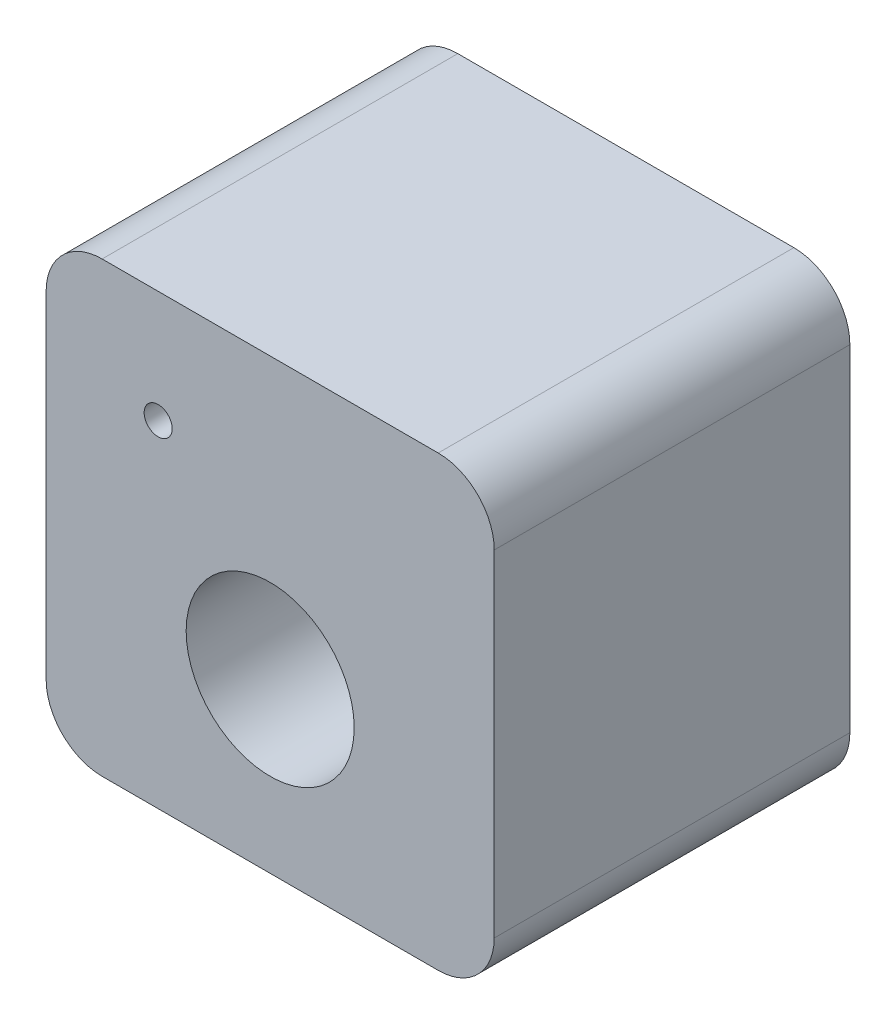
ISO-10303-21;
HEADER;
FILE_DESCRIPTION(('STEP AP214'),'2;1');
FILE_NAME('part.step','',(''),(''),'','','');
FILE_SCHEMA(('AUTOMOTIVE_DESIGN { 1 0 10303 214 1 1 1 1 }'));
ENDSEC;
DATA;
#1=APPLICATION_CONTEXT('core data for automotive mechanical design processes');
#2=APPLICATION_PROTOCOL_DEFINITION('international standard','automotive_design',2000,#1);
#3=PRODUCT_CONTEXT('',#1,'mechanical');
#4=PRODUCT('Part','Part','',(#3));
#5=PRODUCT_RELATED_PRODUCT_CATEGORY('part','',(#4));
#6=PRODUCT_DEFINITION_FORMATION('','',#4);
#7=PRODUCT_DEFINITION_CONTEXT('part definition',#1,'design');
#8=PRODUCT_DEFINITION('design','',#6,#7);
#9=PRODUCT_DEFINITION_SHAPE('','',#8);
#10=(LENGTH_UNIT() NAMED_UNIT(*) SI_UNIT(.MILLI.,.METRE.));
#11=(NAMED_UNIT(*) PLANE_ANGLE_UNIT() SI_UNIT($,.RADIAN.));
#12=(NAMED_UNIT(*) SI_UNIT($,.STERADIAN.) SOLID_ANGLE_UNIT());
#13=UNCERTAINTY_MEASURE_WITH_UNIT(LENGTH_MEASURE(1.E-05),#10,'distance_accuracy_value','');
#14=(GEOMETRIC_REPRESENTATION_CONTEXT(3) GLOBAL_UNCERTAINTY_ASSIGNED_CONTEXT((#13)) GLOBAL_UNIT_ASSIGNED_CONTEXT((#10,
#11,#12)) REPRESENTATION_CONTEXT('',''));
#15=CARTESIAN_POINT('',(0.,0.,0.));
#16=DIRECTION('',(0.,0.,1.));
#17=DIRECTION('',(1.,0.,0.));
#18=AXIS2_PLACEMENT_3D('',#15,#16,#17);
#19=CARTESIAN_POINT('',(0.,0.,6.35));
#20=DIRECTION('',(0.,0.,-1.));
#21=DIRECTION('',(-1.,0.,0.));
#22=AXIS2_PLACEMENT_3D('',#19,#20,#21);
#23=PLANE('',#22);
#24=CARTESIAN_POINT('',(4.,3.,6.35));
#25=DIRECTION('',(0.,0.,1.));
#26=DIRECTION('',(1.,0.,0.));
#27=AXIS2_PLACEMENT_3D('',#24,#25,#26);
#28=CIRCLE('',#27,1.5);
#29=CARTESIAN_POINT('',(5.5,3.,6.35));
#30=VERTEX_POINT('',#29);
#31=EDGE_CURVE('E132',#30,#30,#28,.T.);
#32=ORIENTED_EDGE('',*,*,#31,.F.);
#33=EDGE_LOOP('',(#32));
#34=FACE_BOUND('',#33,.T.);
#35=DIRECTION('',(0.,-1.,0.));
#36=VECTOR('',#35,1.);
#37=CARTESIAN_POINT('',(0.,0.,6.35));
#38=LINE('',#37,#36);
#39=CARTESIAN_POINT('',(0.,7.,6.35));
#40=VERTEX_POINT('',#39);
#41=CARTESIAN_POINT('',(0.,1.,6.35));
#42=VERTEX_POINT('',#41);
#43=EDGE_CURVE('E137',#40,#42,#38,.T.);
#44=ORIENTED_EDGE('',*,*,#43,.T.);
#45=CARTESIAN_POINT('',(1.,1.,6.35));
#46=DIRECTION('',(0.,0.,-1.));
#47=DIRECTION('',(-1.,0.,0.));
#48=AXIS2_PLACEMENT_3D('',#45,#46,#47);
#49=CIRCLE('',#48,1.);
#50=CARTESIAN_POINT('',(1.,0.,6.35));
#51=VERTEX_POINT('',#50);
#52=EDGE_CURVE('E152',#42,#51,#49,.F.);
#53=ORIENTED_EDGE('',*,*,#52,.T.);
#54=DIRECTION('',(1.,0.,0.));
#55=VECTOR('',#54,1.);
#56=CARTESIAN_POINT('',(0.,0.,6.35));
#57=LINE('',#56,#55);
#58=CARTESIAN_POINT('',(7.,0.,6.35));
#59=VERTEX_POINT('',#58);
#60=EDGE_CURVE('E119',#51,#59,#57,.T.);
#61=ORIENTED_EDGE('',*,*,#60,.T.);
#62=CARTESIAN_POINT('',(7.,1.,6.35));
#63=DIRECTION('',(0.,0.,-1.));
#64=DIRECTION('',(-1.,0.,0.));
#65=AXIS2_PLACEMENT_3D('',#62,#63,#64);
#66=CIRCLE('',#65,1.);
#67=CARTESIAN_POINT('',(8.,1.,6.35));
#68=VERTEX_POINT('',#67);
#69=EDGE_CURVE('E150',#59,#68,#66,.F.);
#70=ORIENTED_EDGE('',*,*,#69,.T.);
#71=DIRECTION('',(0.,1.,0.));
#72=VECTOR('',#71,1.);
#73=CARTESIAN_POINT('',(8.,0.,6.35));
#74=LINE('',#73,#72);
#75=CARTESIAN_POINT('',(8.,7.,6.35));
#76=VERTEX_POINT('',#75);
#77=EDGE_CURVE('E163',#68,#76,#74,.T.);
#78=ORIENTED_EDGE('',*,*,#77,.T.);
#79=CARTESIAN_POINT('',(7.,7.,6.35));
#80=DIRECTION('',(0.,0.,-1.));
#81=DIRECTION('',(-1.,0.,0.));
#82=AXIS2_PLACEMENT_3D('',#79,#80,#81);
#83=CIRCLE('',#82,1.);
#84=CARTESIAN_POINT('',(7.,8.,6.35));
#85=VERTEX_POINT('',#84);
#86=EDGE_CURVE('E54',#76,#85,#83,.F.);
#87=ORIENTED_EDGE('',*,*,#86,.T.);
#88=DIRECTION('',(-1.,0.,0.));
#89=VECTOR('',#88,1.);
#90=CARTESIAN_POINT('',(0.,8.,6.35));
#91=LINE('',#90,#89);
#92=CARTESIAN_POINT('',(1.,8.,6.35));
#93=VERTEX_POINT('',#92);
#94=EDGE_CURVE('E138',#85,#93,#91,.T.);
#95=ORIENTED_EDGE('',*,*,#94,.T.);
#96=CARTESIAN_POINT('',(1.,7.,6.35));
#97=DIRECTION('',(0.,0.,-1.));
#98=DIRECTION('',(-1.,0.,0.));
#99=AXIS2_PLACEMENT_3D('',#96,#97,#98);
#100=CIRCLE('',#99,1.);
#101=EDGE_CURVE('E147',#93,#40,#100,.F.);
#102=ORIENTED_EDGE('',*,*,#101,.T.);
#103=EDGE_LOOP('',(#44,#53,#61,#70,#78,#87,#95,#102));
#104=FACE_BOUND('',#103,.T.);
#105=CARTESIAN_POINT('',(2.,6.,6.35));
#106=DIRECTION('',(0.,0.,1.));
#107=DIRECTION('',(1.,0.,0.));
#108=AXIS2_PLACEMENT_3D('',#105,#106,#107);
#109=CIRCLE('',#108,0.25);
#110=CARTESIAN_POINT('',(2.25,6.,6.35));
#111=VERTEX_POINT('',#110);
#112=EDGE_CURVE('E180',#111,#111,#109,.T.);
#113=ORIENTED_EDGE('',*,*,#112,.F.);
#114=EDGE_LOOP('',(#113));
#115=FACE_BOUND('',#114,.T.);
#116=ADVANCED_FACE('F33',(#34,#104,#115),#23,.F.);
#117=CARTESIAN_POINT('',(0.,0.,0.));
#118=DIRECTION('',(0.,0.,-1.));
#119=DIRECTION('',(-1.,0.,0.));
#120=AXIS2_PLACEMENT_3D('',#117,#118,#119);
#121=PLANE('',#120);
#122=CARTESIAN_POINT('',(4.,3.,0.));
#123=DIRECTION('',(0.,0.,1.));
#124=DIRECTION('',(1.,0.,0.));
#125=AXIS2_PLACEMENT_3D('',#122,#123,#124);
#126=CIRCLE('',#125,1.5);
#127=CARTESIAN_POINT('',(5.5,3.,0.));
#128=VERTEX_POINT('',#127);
#129=EDGE_CURVE('E177',#128,#128,#126,.T.);
#130=ORIENTED_EDGE('',*,*,#129,.T.);
#131=EDGE_LOOP('',(#130));
#132=FACE_BOUND('',#131,.T.);
#133=DIRECTION('',(1.,0.,0.));
#134=VECTOR('',#133,1.);
#135=CARTESIAN_POINT('',(0.,0.,0.));
#136=LINE('',#135,#134);
#137=CARTESIAN_POINT('',(1.,0.,0.));
#138=VERTEX_POINT('',#137);
#139=CARTESIAN_POINT('',(7.,0.,0.));
#140=VERTEX_POINT('',#139);
#141=EDGE_CURVE('E116',#138,#140,#136,.T.);
#142=ORIENTED_EDGE('',*,*,#141,.F.);
#143=CARTESIAN_POINT('',(1.,1.,0.));
#144=DIRECTION('',(0.,0.,-1.));
#145=DIRECTION('',(-1.,0.,0.));
#146=AXIS2_PLACEMENT_3D('',#143,#144,#145);
#147=CIRCLE('',#146,1.);
#148=CARTESIAN_POINT('',(0.,1.,0.));
#149=VERTEX_POINT('',#148);
#150=EDGE_CURVE('E99',#138,#149,#147,.T.);
#151=ORIENTED_EDGE('',*,*,#150,.T.);
#152=DIRECTION('',(0.,-1.,0.));
#153=VECTOR('',#152,1.);
#154=CARTESIAN_POINT('',(0.,0.,0.));
#155=LINE('',#154,#153);
#156=CARTESIAN_POINT('',(0.,7.,0.));
#157=VERTEX_POINT('',#156);
#158=EDGE_CURVE('E127',#157,#149,#155,.T.);
#159=ORIENTED_EDGE('',*,*,#158,.F.);
#160=CARTESIAN_POINT('',(1.,7.,0.));
#161=DIRECTION('',(0.,0.,-1.));
#162=DIRECTION('',(-1.,0.,0.));
#163=AXIS2_PLACEMENT_3D('',#160,#161,#162);
#164=CIRCLE('',#163,1.);
#165=CARTESIAN_POINT('',(1.,8.,0.));
#166=VERTEX_POINT('',#165);
#167=EDGE_CURVE('E120',#157,#166,#164,.T.);
#168=ORIENTED_EDGE('',*,*,#167,.T.);
#169=DIRECTION('',(-1.,0.,0.));
#170=VECTOR('',#169,1.);
#171=CARTESIAN_POINT('',(0.,8.,0.));
#172=LINE('',#171,#170);
#173=CARTESIAN_POINT('',(7.,8.,0.));
#174=VERTEX_POINT('',#173);
#175=EDGE_CURVE('E130',#174,#166,#172,.T.);
#176=ORIENTED_EDGE('',*,*,#175,.F.);
#177=CARTESIAN_POINT('',(7.,7.,0.));
#178=DIRECTION('',(0.,0.,-1.));
#179=DIRECTION('',(-1.,0.,0.));
#180=AXIS2_PLACEMENT_3D('',#177,#178,#179);
#181=CIRCLE('',#180,1.);
#182=CARTESIAN_POINT('',(8.,7.,0.));
#183=VERTEX_POINT('',#182);
#184=EDGE_CURVE('E141',#174,#183,#181,.T.);
#185=ORIENTED_EDGE('',*,*,#184,.T.);
#186=DIRECTION('',(0.,1.,0.));
#187=VECTOR('',#186,1.);
#188=CARTESIAN_POINT('',(8.,0.,0.));
#189=LINE('',#188,#187);
#190=CARTESIAN_POINT('',(8.,1.,0.));
#191=VERTEX_POINT('',#190);
#192=EDGE_CURVE('E126',#191,#183,#189,.T.);
#193=ORIENTED_EDGE('',*,*,#192,.F.);
#194=CARTESIAN_POINT('',(7.,1.,0.));
#195=DIRECTION('',(0.,0.,-1.));
#196=DIRECTION('',(-1.,0.,0.));
#197=AXIS2_PLACEMENT_3D('',#194,#195,#196);
#198=CIRCLE('',#197,1.);
#199=EDGE_CURVE('E110',#191,#140,#198,.T.);
#200=ORIENTED_EDGE('',*,*,#199,.T.);
#201=EDGE_LOOP('',(#142,#151,#159,#168,#176,#185,#193,#200));
#202=FACE_BOUND('',#201,.T.);
#203=CARTESIAN_POINT('',(2.,6.,0.));
#204=DIRECTION('',(0.,0.,1.));
#205=DIRECTION('',(1.,0.,0.));
#206=AXIS2_PLACEMENT_3D('',#203,#204,#205);
#207=CIRCLE('',#206,0.25);
#208=CARTESIAN_POINT('',(2.25,6.,0.));
#209=VERTEX_POINT('',#208);
#210=EDGE_CURVE('E183',#209,#209,#207,.T.);
#211=ORIENTED_EDGE('',*,*,#210,.T.);
#212=EDGE_LOOP('',(#211));
#213=FACE_BOUND('',#212,.T.);
#214=ADVANCED_FACE('F123',(#132,#202,#213),#121,.T.);
#215=CARTESIAN_POINT('',(0.,0.,6.35));
#216=DIRECTION('',(1.,0.,0.));
#217=DIRECTION('',(0.,0.,-1.));
#218=AXIS2_PLACEMENT_3D('',#215,#216,#217);
#219=PLANE('',#218);
#220=ORIENTED_EDGE('',*,*,#158,.T.);
#221=DIRECTION('',(0.,0.,-1.));
#222=VECTOR('',#221,1.);
#223=CARTESIAN_POINT('',(0.,1.,6.35));
#224=LINE('',#223,#222);
#225=EDGE_CURVE('E104',#149,#42,#224,.F.);
#226=ORIENTED_EDGE('',*,*,#225,.T.);
#227=ORIENTED_EDGE('',*,*,#43,.F.);
#228=DIRECTION('',(0.,0.,-1.));
#229=VECTOR('',#228,1.);
#230=CARTESIAN_POINT('',(0.,7.,6.35));
#231=LINE('',#230,#229);
#232=EDGE_CURVE('E109',#40,#157,#231,.T.);
#233=ORIENTED_EDGE('',*,*,#232,.T.);
#234=EDGE_LOOP('',(#220,#226,#227,#233));
#235=FACE_BOUND('',#234,.T.);
#236=ADVANCED_FACE('F198',(#235),#219,.F.);
#237=CARTESIAN_POINT('',(0.,0.,6.35));
#238=DIRECTION('',(0.,1.,0.));
#239=DIRECTION('',(0.,0.,1.));
#240=AXIS2_PLACEMENT_3D('',#237,#238,#239);
#241=PLANE('',#240);
#242=ORIENTED_EDGE('',*,*,#60,.F.);
#243=DIRECTION('',(0.,0.,-1.));
#244=VECTOR('',#243,1.);
#245=CARTESIAN_POINT('',(1.,0.,6.35));
#246=LINE('',#245,#244);
#247=EDGE_CURVE('E103',#51,#138,#246,.T.);
#248=ORIENTED_EDGE('',*,*,#247,.T.);
#249=ORIENTED_EDGE('',*,*,#141,.T.);
#250=DIRECTION('',(0.,0.,-1.));
#251=VECTOR('',#250,1.);
#252=CARTESIAN_POINT('',(7.,0.,6.35));
#253=LINE('',#252,#251);
#254=EDGE_CURVE('E121',#140,#59,#253,.F.);
#255=ORIENTED_EDGE('',*,*,#254,.T.);
#256=EDGE_LOOP('',(#242,#248,#249,#255));
#257=FACE_BOUND('',#256,.T.);
#258=ADVANCED_FACE('F115',(#257),#241,.F.);
#259=CARTESIAN_POINT('',(8.,0.,6.35));
#260=DIRECTION('',(-1.,0.,0.));
#261=DIRECTION('',(0.,0.,1.));
#262=AXIS2_PLACEMENT_3D('',#259,#260,#261);
#263=PLANE('',#262);
#264=ORIENTED_EDGE('',*,*,#77,.F.);
#265=DIRECTION('',(0.,0.,-1.));
#266=VECTOR('',#265,1.);
#267=CARTESIAN_POINT('',(8.,1.,6.35));
#268=LINE('',#267,#266);
#269=EDGE_CURVE('E156',#68,#191,#268,.T.);
#270=ORIENTED_EDGE('',*,*,#269,.T.);
#271=ORIENTED_EDGE('',*,*,#192,.T.);
#272=DIRECTION('',(0.,0.,-1.));
#273=VECTOR('',#272,1.);
#274=CARTESIAN_POINT('',(8.,7.,6.35));
#275=LINE('',#274,#273);
#276=EDGE_CURVE('E154',#183,#76,#275,.F.);
#277=ORIENTED_EDGE('',*,*,#276,.T.);
#278=EDGE_LOOP('',(#264,#270,#271,#277));
#279=FACE_BOUND('',#278,.T.);
#280=ADVANCED_FACE('F161',(#279),#263,.F.);
#281=CARTESIAN_POINT('',(0.,8.,6.35));
#282=DIRECTION('',(0.,-1.,0.));
#283=DIRECTION('',(0.,0.,-1.));
#284=AXIS2_PLACEMENT_3D('',#281,#282,#283);
#285=PLANE('',#284);
#286=ORIENTED_EDGE('',*,*,#94,.F.);
#287=DIRECTION('',(0.,0.,-1.));
#288=VECTOR('',#287,1.);
#289=CARTESIAN_POINT('',(7.,8.,6.35));
#290=LINE('',#289,#288);
#291=EDGE_CURVE('E11',#85,#174,#290,.T.);
#292=ORIENTED_EDGE('',*,*,#291,.T.);
#293=ORIENTED_EDGE('',*,*,#175,.T.);
#294=DIRECTION('',(0.,0.,-1.));
#295=VECTOR('',#294,1.);
#296=CARTESIAN_POINT('',(1.,8.,6.35));
#297=LINE('',#296,#295);
#298=EDGE_CURVE('E41',#166,#93,#297,.F.);
#299=ORIENTED_EDGE('',*,*,#298,.T.);
#300=EDGE_LOOP('',(#286,#292,#293,#299));
#301=FACE_BOUND('',#300,.T.);
#302=ADVANCED_FACE('F170',(#301),#285,.F.);
#303=CARTESIAN_POINT('',(4.,3.,6.35));
#304=DIRECTION('',(0.,0.,-1.));
#305=DIRECTION('',(-1.,0.,0.));
#306=AXIS2_PLACEMENT_3D('',#303,#304,#305);
#307=CYLINDRICAL_SURFACE('',#306,1.5);
#308=ORIENTED_EDGE('',*,*,#31,.T.);
#309=EDGE_LOOP('',(#308));
#310=FACE_BOUND('',#309,.T.);
#311=ORIENTED_EDGE('',*,*,#129,.F.);
#312=EDGE_LOOP('',(#311));
#313=FACE_BOUND('',#312,.T.);
#314=ADVANCED_FACE('F203',(#310,#313),#307,.F.);
#315=CARTESIAN_POINT('',(2.,6.,6.35));
#316=DIRECTION('',(0.,0.,-1.));
#317=DIRECTION('',(-1.,0.,0.));
#318=AXIS2_PLACEMENT_3D('',#315,#316,#317);
#319=CYLINDRICAL_SURFACE('',#318,0.25);
#320=ORIENTED_EDGE('',*,*,#112,.T.);
#321=EDGE_LOOP('',(#320));
#322=FACE_BOUND('',#321,.T.);
#323=ORIENTED_EDGE('',*,*,#210,.F.);
#324=EDGE_LOOP('',(#323));
#325=FACE_BOUND('',#324,.T.);
#326=ADVANCED_FACE('F189',(#322,#325),#319,.F.);
#327=CARTESIAN_POINT('',(1.,1.,6.35));
#328=DIRECTION('',(0.,0.,-1.));
#329=DIRECTION('',(-1.,0.,0.));
#330=AXIS2_PLACEMENT_3D('',#327,#328,#329);
#331=CYLINDRICAL_SURFACE('',#330,1.);
#332=ORIENTED_EDGE('',*,*,#52,.F.);
#333=ORIENTED_EDGE('',*,*,#225,.F.);
#334=ORIENTED_EDGE('',*,*,#150,.F.);
#335=ORIENTED_EDGE('',*,*,#247,.F.);
#336=EDGE_LOOP('',(#332,#333,#334,#335));
#337=FACE_BOUND('',#336,.T.);
#338=ADVANCED_FACE('F102',(#337),#331,.T.);
#339=CARTESIAN_POINT('',(7.,1.,6.35));
#340=DIRECTION('',(0.,0.,-1.));
#341=DIRECTION('',(-1.,0.,0.));
#342=AXIS2_PLACEMENT_3D('',#339,#340,#341);
#343=CYLINDRICAL_SURFACE('',#342,1.);
#344=ORIENTED_EDGE('',*,*,#69,.F.);
#345=ORIENTED_EDGE('',*,*,#254,.F.);
#346=ORIENTED_EDGE('',*,*,#199,.F.);
#347=ORIENTED_EDGE('',*,*,#269,.F.);
#348=EDGE_LOOP('',(#344,#345,#346,#347));
#349=FACE_BOUND('',#348,.T.);
#350=ADVANCED_FACE('F217',(#349),#343,.T.);
#351=CARTESIAN_POINT('',(7.,7.,6.35));
#352=DIRECTION('',(0.,0.,-1.));
#353=DIRECTION('',(-1.,0.,0.));
#354=AXIS2_PLACEMENT_3D('',#351,#352,#353);
#355=CYLINDRICAL_SURFACE('',#354,1.);
#356=ORIENTED_EDGE('',*,*,#86,.F.);
#357=ORIENTED_EDGE('',*,*,#276,.F.);
#358=ORIENTED_EDGE('',*,*,#184,.F.);
#359=ORIENTED_EDGE('',*,*,#291,.F.);
#360=EDGE_LOOP('',(#356,#357,#358,#359));
#361=FACE_BOUND('',#360,.T.);
#362=ADVANCED_FACE('F169',(#361),#355,.T.);
#363=CARTESIAN_POINT('',(1.,7.,6.35));
#364=DIRECTION('',(0.,0.,-1.));
#365=DIRECTION('',(-1.,0.,0.));
#366=AXIS2_PLACEMENT_3D('',#363,#364,#365);
#367=CYLINDRICAL_SURFACE('',#366,1.);
#368=ORIENTED_EDGE('',*,*,#101,.F.);
#369=ORIENTED_EDGE('',*,*,#298,.F.);
#370=ORIENTED_EDGE('',*,*,#167,.F.);
#371=ORIENTED_EDGE('',*,*,#232,.F.);
#372=EDGE_LOOP('',(#368,#369,#370,#371));
#373=FACE_BOUND('',#372,.T.);
#374=ADVANCED_FACE('F35',(#373),#367,.T.);
#375=CLOSED_SHELL('',(#116,#214,#236,#258,#280,#302,#314,#326,#338,#350,#362,#374));
#376=MANIFOLD_SOLID_BREP('B2',#375);
#377=ADVANCED_BREP_SHAPE_REPRESENTATION('',(#18,#376),#14);
#378=SHAPE_DEFINITION_REPRESENTATION(#9,#377);
ENDSEC;
END-ISO-10303-21;
